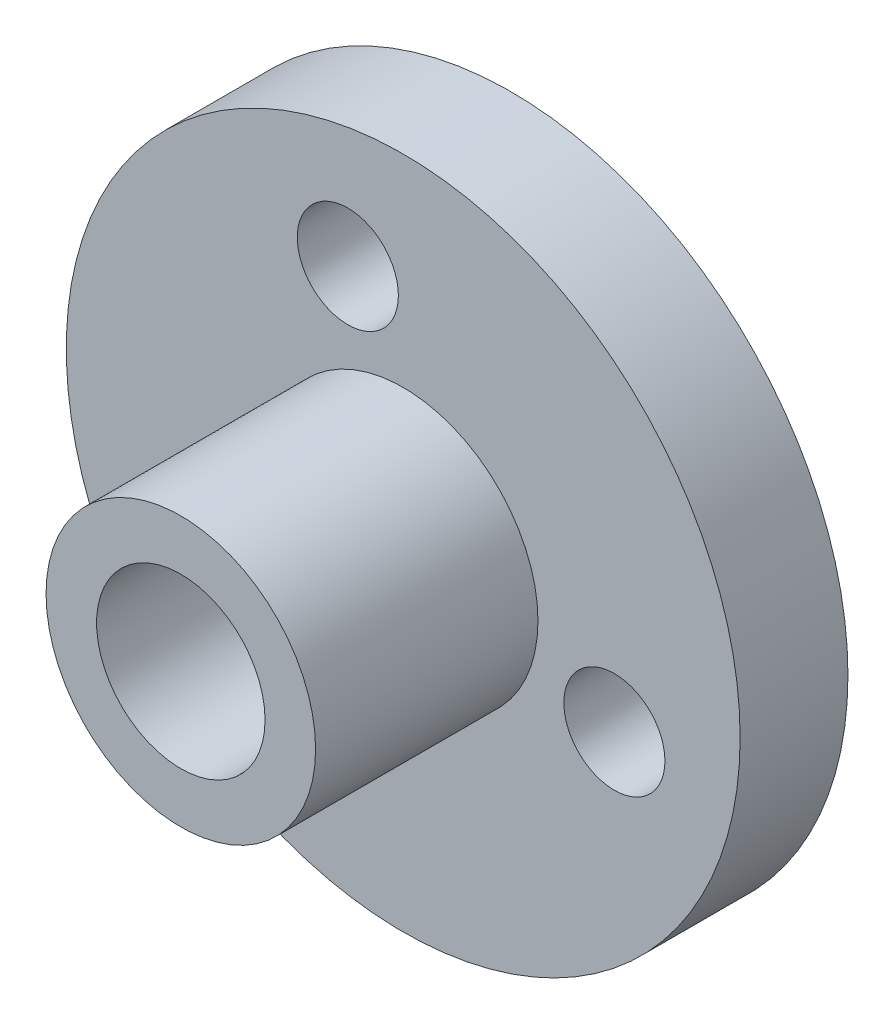
ISO-10303-21;
HEADER;
FILE_DESCRIPTION(('STEP AP214'),'2;1');
FILE_NAME('part.step','',(''),(''),'','','');
FILE_SCHEMA(('AUTOMOTIVE_DESIGN { 1 0 10303 214 1 1 1 1 }'));
ENDSEC;
DATA;
#1=APPLICATION_CONTEXT('core data for automotive mechanical design processes');
#2=APPLICATION_PROTOCOL_DEFINITION('international standard','automotive_design',2000,#1);
#3=PRODUCT_CONTEXT('',#1,'mechanical');
#4=PRODUCT('Part','Part','',(#3));
#5=PRODUCT_RELATED_PRODUCT_CATEGORY('part','',(#4));
#6=PRODUCT_DEFINITION_FORMATION('','',#4);
#7=PRODUCT_DEFINITION_CONTEXT('part definition',#1,'design');
#8=PRODUCT_DEFINITION('design','',#6,#7);
#9=PRODUCT_DEFINITION_SHAPE('','',#8);
#10=(LENGTH_UNIT() NAMED_UNIT(*) SI_UNIT(.MILLI.,.METRE.));
#11=(NAMED_UNIT(*) PLANE_ANGLE_UNIT() SI_UNIT($,.RADIAN.));
#12=(NAMED_UNIT(*) SI_UNIT($,.STERADIAN.) SOLID_ANGLE_UNIT());
#13=UNCERTAINTY_MEASURE_WITH_UNIT(LENGTH_MEASURE(1.E-05),#10,'distance_accuracy_value','');
#14=(GEOMETRIC_REPRESENTATION_CONTEXT(3) GLOBAL_UNCERTAINTY_ASSIGNED_CONTEXT((#13)) GLOBAL_UNIT_ASSIGNED_CONTEXT((#10,
#11,#12)) REPRESENTATION_CONTEXT('',''));
#15=CARTESIAN_POINT('',(0.,0.,0.));
#16=DIRECTION('',(0.,0.,1.));
#17=DIRECTION('',(1.,0.,0.));
#18=AXIS2_PLACEMENT_3D('',#15,#16,#17);
#19=CARTESIAN_POINT('',(0.,0.,3.2));
#20=DIRECTION('',(0.,0.,-1.));
#21=DIRECTION('',(-1.,0.,0.));
#22=AXIS2_PLACEMENT_3D('',#19,#20,#21);
#23=CYLINDRICAL_SURFACE('',#22,10.);
#24=CARTESIAN_POINT('',(0.,0.,3.2));
#25=DIRECTION('',(0.,0.,1.));
#26=DIRECTION('',(1.,0.,0.));
#27=AXIS2_PLACEMENT_3D('',#24,#25,#26);
#28=CIRCLE('',#27,10.);
#29=CARTESIAN_POINT('',(10.,0.,3.2));
#30=VERTEX_POINT('',#29);
#31=EDGE_CURVE('E10',#30,#30,#28,.T.);
#32=ORIENTED_EDGE('',*,*,#31,.F.);
#33=EDGE_LOOP('',(#32));
#34=FACE_BOUND('',#33,.T.);
#35=CARTESIAN_POINT('',(0.,0.,0.));
#36=DIRECTION('',(0.,0.,1.));
#37=DIRECTION('',(1.,0.,0.));
#38=AXIS2_PLACEMENT_3D('',#35,#36,#37);
#39=CIRCLE('',#38,10.);
#40=CARTESIAN_POINT('',(10.,0.,0.));
#41=VERTEX_POINT('',#40);
#42=EDGE_CURVE('E34',#41,#41,#39,.T.);
#43=ORIENTED_EDGE('',*,*,#42,.T.);
#44=EDGE_LOOP('',(#43));
#45=FACE_BOUND('',#44,.T.);
#46=ADVANCED_FACE('F31',(#34,#45),#23,.T.);
#47=CARTESIAN_POINT('',(0.,0.,3.2));
#48=DIRECTION('',(0.,0.,1.));
#49=DIRECTION('',(1.,0.,0.));
#50=AXIS2_PLACEMENT_3D('',#47,#48,#49);
#51=PLANE('',#50);
#52=CARTESIAN_POINT('',(6.2679436334564,-1.72130259042867,3.2));
#53=DIRECTION('',(0.,0.,1.));
#54=DIRECTION('',(1.,0.,0.));
#55=AXIS2_PLACEMENT_3D('',#52,#53,#54);
#56=CIRCLE('',#55,1.50000000000043);
#57=CARTESIAN_POINT('',(7.76794363345683,-1.72130259042867,3.2));
#58=VERTEX_POINT('',#57);
#59=EDGE_CURVE('E62',#58,#58,#56,.T.);
#60=ORIENTED_EDGE('',*,*,#59,.F.);
#61=EDGE_LOOP('',(#60));
#62=FACE_BOUND('',#61,.T.);
#63=CARTESIAN_POINT('',(-4.62466358763905,-4.56754712084751,3.2));
#64=DIRECTION('',(0.,0.,1.));
#65=DIRECTION('',(1.,0.,0.));
#66=AXIS2_PLACEMENT_3D('',#63,#64,#65);
#67=CIRCLE('',#66,1.50000000000049);
#68=CARTESIAN_POINT('',(-3.12466358763856,-4.56754712084751,3.2));
#69=VERTEX_POINT('',#68);
#70=EDGE_CURVE('E55',#69,#69,#67,.T.);
#71=ORIENTED_EDGE('',*,*,#70,.F.);
#72=EDGE_LOOP('',(#71));
#73=FACE_BOUND('',#72,.T.);
#74=CARTESIAN_POINT('',(-1.64328004581655,6.28884971127639,3.2));
#75=DIRECTION('',(0.,0.,1.));
#76=DIRECTION('',(1.,0.,0.));
#77=AXIS2_PLACEMENT_3D('',#74,#75,#76);
#78=CIRCLE('',#77,1.5);
#79=CARTESIAN_POINT('',(-0.143280045816549,6.28884971127639,3.2));
#80=VERTEX_POINT('',#79);
#81=EDGE_CURVE('E49',#80,#80,#78,.T.);
#82=ORIENTED_EDGE('',*,*,#81,.F.);
#83=EDGE_LOOP('',(#82));
#84=FACE_BOUND('',#83,.T.);
#85=CARTESIAN_POINT('',(0.,0.,3.2));
#86=DIRECTION('',(0.,0.,1.));
#87=DIRECTION('',(1.,0.,0.));
#88=AXIS2_PLACEMENT_3D('',#85,#86,#87);
#89=CIRCLE('',#88,4.);
#90=CARTESIAN_POINT('',(4.,0.,3.2));
#91=VERTEX_POINT('',#90);
#92=EDGE_CURVE('E43',#91,#91,#89,.T.);
#93=ORIENTED_EDGE('',*,*,#92,.F.);
#94=EDGE_LOOP('',(#93));
#95=FACE_BOUND('',#94,.T.);
#96=ORIENTED_EDGE('',*,*,#31,.T.);
#97=EDGE_LOOP('',(#96));
#98=FACE_BOUND('',#97,.T.);
#99=ADVANCED_FACE('F96',(#62,#73,#84,#95,#98),#51,.T.);
#100=CARTESIAN_POINT('',(0.,0.,0.));
#101=DIRECTION('',(0.,0.,1.));
#102=DIRECTION('',(1.,0.,0.));
#103=AXIS2_PLACEMENT_3D('',#100,#101,#102);
#104=PLANE('',#103);
#105=CARTESIAN_POINT('',(0.,0.,0.));
#106=DIRECTION('',(0.,0.,1.));
#107=DIRECTION('',(1.,0.,0.));
#108=AXIS2_PLACEMENT_3D('',#105,#106,#107);
#109=CIRCLE('',#108,2.5);
#110=CARTESIAN_POINT('',(2.5,0.,0.));
#111=VERTEX_POINT('',#110);
#112=EDGE_CURVE('E59',#111,#111,#109,.T.);
#113=ORIENTED_EDGE('',*,*,#112,.T.);
#114=EDGE_LOOP('',(#113));
#115=FACE_BOUND('',#114,.T.);
#116=CARTESIAN_POINT('',(6.2679436334564,-1.72130259042867,0.));
#117=DIRECTION('',(0.,0.,1.));
#118=DIRECTION('',(1.,0.,0.));
#119=AXIS2_PLACEMENT_3D('',#116,#117,#118);
#120=CIRCLE('',#119,1.50000000000043);
#121=CARTESIAN_POINT('',(7.76794363345683,-1.72130259042867,0.));
#122=VERTEX_POINT('',#121);
#123=EDGE_CURVE('E52',#122,#122,#120,.T.);
#124=ORIENTED_EDGE('',*,*,#123,.T.);
#125=EDGE_LOOP('',(#124));
#126=FACE_BOUND('',#125,.T.);
#127=CARTESIAN_POINT('',(-4.62466358763905,-4.56754712084751,0.));
#128=DIRECTION('',(0.,0.,1.));
#129=DIRECTION('',(1.,0.,0.));
#130=AXIS2_PLACEMENT_3D('',#127,#128,#129);
#131=CIRCLE('',#130,1.50000000000049);
#132=CARTESIAN_POINT('',(-3.12466358763856,-4.56754712084751,0.));
#133=VERTEX_POINT('',#132);
#134=EDGE_CURVE('E58',#133,#133,#131,.T.);
#135=ORIENTED_EDGE('',*,*,#134,.T.);
#136=EDGE_LOOP('',(#135));
#137=FACE_BOUND('',#136,.T.);
#138=CARTESIAN_POINT('',(-1.64328004581655,6.28884971127639,0.));
#139=DIRECTION('',(0.,0.,1.));
#140=DIRECTION('',(1.,0.,0.));
#141=AXIS2_PLACEMENT_3D('',#138,#139,#140);
#142=CIRCLE('',#141,1.5);
#143=CARTESIAN_POINT('',(-0.143280045816549,6.28884971127639,0.));
#144=VERTEX_POINT('',#143);
#145=EDGE_CURVE('E46',#144,#144,#142,.T.);
#146=ORIENTED_EDGE('',*,*,#145,.T.);
#147=EDGE_LOOP('',(#146));
#148=FACE_BOUND('',#147,.T.);
#149=ORIENTED_EDGE('',*,*,#42,.F.);
#150=EDGE_LOOP('',(#149));
#151=FACE_BOUND('',#150,.T.);
#152=ADVANCED_FACE('F73',(#115,#126,#137,#148,#151),#104,.F.);
#153=CARTESIAN_POINT('',(0.,0.,9.8));
#154=DIRECTION('',(0.,0.,-1.));
#155=DIRECTION('',(-1.,0.,0.));
#156=AXIS2_PLACEMENT_3D('',#153,#154,#155);
#157=CYLINDRICAL_SURFACE('',#156,4.);
#158=CARTESIAN_POINT('',(0.,0.,9.8));
#159=DIRECTION('',(0.,0.,1.));
#160=DIRECTION('',(1.,0.,0.));
#161=AXIS2_PLACEMENT_3D('',#158,#159,#160);
#162=CIRCLE('',#161,4.);
#163=CARTESIAN_POINT('',(4.,0.,9.8));
#164=VERTEX_POINT('',#163);
#165=EDGE_CURVE('E41',#164,#164,#162,.T.);
#166=ORIENTED_EDGE('',*,*,#165,.F.);
#167=EDGE_LOOP('',(#166));
#168=FACE_BOUND('',#167,.T.);
#169=ORIENTED_EDGE('',*,*,#92,.T.);
#170=EDGE_LOOP('',(#169));
#171=FACE_BOUND('',#170,.T.);
#172=ADVANCED_FACE('F87',(#168,#171),#157,.T.);
#173=CARTESIAN_POINT('',(0.,0.,9.8));
#174=DIRECTION('',(0.,0.,1.));
#175=DIRECTION('',(1.,0.,0.));
#176=AXIS2_PLACEMENT_3D('',#173,#174,#175);
#177=PLANE('',#176);
#178=CARTESIAN_POINT('',(0.,0.,9.8));
#179=DIRECTION('',(0.,0.,1.));
#180=DIRECTION('',(1.,0.,0.));
#181=AXIS2_PLACEMENT_3D('',#178,#179,#180);
#182=CIRCLE('',#181,2.5);
#183=CARTESIAN_POINT('',(2.5,0.,9.8));
#184=VERTEX_POINT('',#183);
#185=EDGE_CURVE('E67',#184,#184,#182,.T.);
#186=ORIENTED_EDGE('',*,*,#185,.F.);
#187=EDGE_LOOP('',(#186));
#188=FACE_BOUND('',#187,.T.);
#189=ORIENTED_EDGE('',*,*,#165,.T.);
#190=EDGE_LOOP('',(#189));
#191=FACE_BOUND('',#190,.T.);
#192=ADVANCED_FACE('F83',(#188,#191),#177,.T.);
#193=CARTESIAN_POINT('',(-1.64328004581655,6.28884971127639,0.));
#194=DIRECTION('',(0.,0.,1.));
#195=DIRECTION('',(1.,0.,0.));
#196=AXIS2_PLACEMENT_3D('',#193,#194,#195);
#197=CYLINDRICAL_SURFACE('',#196,1.5);
#198=ORIENTED_EDGE('',*,*,#145,.F.);
#199=EDGE_LOOP('',(#198));
#200=FACE_BOUND('',#199,.T.);
#201=ORIENTED_EDGE('',*,*,#81,.T.);
#202=EDGE_LOOP('',(#201));
#203=FACE_BOUND('',#202,.T.);
#204=ADVANCED_FACE('F86',(#200,#203),#197,.F.);
#205=CARTESIAN_POINT('',(-4.62466358763905,-4.56754712084751,0.));
#206=DIRECTION('',(0.,0.,1.));
#207=DIRECTION('',(1.,0.,0.));
#208=AXIS2_PLACEMENT_3D('',#205,#206,#207);
#209=CYLINDRICAL_SURFACE('',#208,1.50000000000049);
#210=ORIENTED_EDGE('',*,*,#134,.F.);
#211=EDGE_LOOP('',(#210));
#212=FACE_BOUND('',#211,.T.);
#213=ORIENTED_EDGE('',*,*,#70,.T.);
#214=EDGE_LOOP('',(#213));
#215=FACE_BOUND('',#214,.T.);
#216=ADVANCED_FACE('F110',(#212,#215),#209,.F.);
#217=CARTESIAN_POINT('',(6.2679436334564,-1.72130259042867,0.));
#218=DIRECTION('',(0.,0.,1.));
#219=DIRECTION('',(1.,0.,0.));
#220=AXIS2_PLACEMENT_3D('',#217,#218,#219);
#221=CYLINDRICAL_SURFACE('',#220,1.50000000000043);
#222=ORIENTED_EDGE('',*,*,#123,.F.);
#223=EDGE_LOOP('',(#222));
#224=FACE_BOUND('',#223,.T.);
#225=ORIENTED_EDGE('',*,*,#59,.T.);
#226=EDGE_LOOP('',(#225));
#227=FACE_BOUND('',#226,.T.);
#228=ADVANCED_FACE('F79',(#224,#227),#221,.F.);
#229=CARTESIAN_POINT('',(0.,0.,0.));
#230=DIRECTION('',(0.,0.,1.));
#231=DIRECTION('',(1.,0.,0.));
#232=AXIS2_PLACEMENT_3D('',#229,#230,#231);
#233=CYLINDRICAL_SURFACE('',#232,2.5);
#234=ORIENTED_EDGE('',*,*,#112,.F.);
#235=EDGE_LOOP('',(#234));
#236=FACE_BOUND('',#235,.T.);
#237=ORIENTED_EDGE('',*,*,#185,.T.);
#238=EDGE_LOOP('',(#237));
#239=FACE_BOUND('',#238,.T.);
#240=ADVANCED_FACE('F76',(#236,#239),#233,.F.);
#241=CLOSED_SHELL('',(#46,#99,#152,#172,#192,#204,#216,#228,#240));
#242=MANIFOLD_SOLID_BREP('B2',#241);
#243=ADVANCED_BREP_SHAPE_REPRESENTATION('',(#18,#242),#14);
#244=SHAPE_DEFINITION_REPRESENTATION(#9,#243);
ENDSEC;
END-ISO-10303-21;
